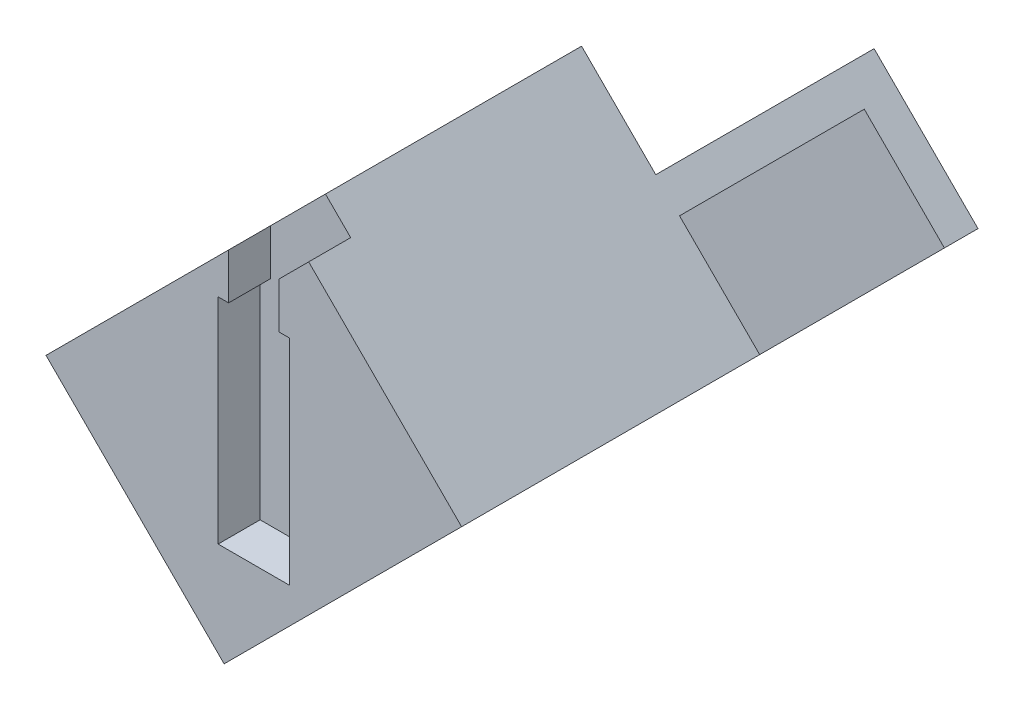
ISO-10303-21;
HEADER;
FILE_DESCRIPTION(('STEP AP214'),'2;1');
FILE_NAME('part.step','',(''),(''),'','','');
FILE_SCHEMA(('AUTOMOTIVE_DESIGN { 1 0 10303 214 1 1 1 1 }'));
ENDSEC;
DATA;
#1=APPLICATION_CONTEXT('core data for automotive mechanical design processes');
#2=APPLICATION_PROTOCOL_DEFINITION('international standard','automotive_design',2000,#1);
#3=PRODUCT_CONTEXT('',#1,'mechanical');
#4=PRODUCT('Part','Part','',(#3));
#5=PRODUCT_RELATED_PRODUCT_CATEGORY('part','',(#4));
#6=PRODUCT_DEFINITION_FORMATION('','',#4);
#7=PRODUCT_DEFINITION_CONTEXT('part definition',#1,'design');
#8=PRODUCT_DEFINITION('design','',#6,#7);
#9=PRODUCT_DEFINITION_SHAPE('','',#8);
#10=(LENGTH_UNIT() NAMED_UNIT(*) SI_UNIT(.MILLI.,.METRE.));
#11=(NAMED_UNIT(*) PLANE_ANGLE_UNIT() SI_UNIT($,.RADIAN.));
#12=(NAMED_UNIT(*) SI_UNIT($,.STERADIAN.) SOLID_ANGLE_UNIT());
#13=UNCERTAINTY_MEASURE_WITH_UNIT(LENGTH_MEASURE(1.E-05),#10,'distance_accuracy_value','');
#14=(GEOMETRIC_REPRESENTATION_CONTEXT(3) GLOBAL_UNCERTAINTY_ASSIGNED_CONTEXT((#13)) GLOBAL_UNIT_ASSIGNED_CONTEXT((#10,
#11,#12)) REPRESENTATION_CONTEXT('',''));
#15=CARTESIAN_POINT('',(0.,0.,0.));
#16=DIRECTION('',(0.,0.,1.));
#17=DIRECTION('',(1.,0.,0.));
#18=AXIS2_PLACEMENT_3D('',#15,#16,#17);
#19=CARTESIAN_POINT('',(-24.6428637527933,-43.7641840963524,-47.5));
#20=DIRECTION('',(0.707106781186542,-0.707106781186554,0.));
#21=DIRECTION('',(0.707106781186554,0.707106781186541,0.));
#22=AXIS2_PLACEMENT_3D('',#19,#20,#21);
#23=PLANE('',#22);
#24=DIRECTION('',(0.,0.,1.));
#25=VECTOR('',#24,1.);
#26=CARTESIAN_POINT('',(17.3314754519512,-1.78984489160859,-25.5));
#27=LINE('',#26,#25);
#28=CARTESIAN_POINT('',(17.3314754519512,-1.78984489160859,-47.5));
#29=VERTEX_POINT('',#28);
#30=CARTESIAN_POINT('',(17.3314754519512,-1.78984489160859,-25.5));
#31=VERTEX_POINT('',#30);
#32=EDGE_CURVE('E426',#29,#31,#27,.T.);
#33=ORIENTED_EDGE('',*,*,#32,.F.);
#34=DIRECTION('',(0.707106781186554,0.707106781186542,0.));
#35=VECTOR('',#34,1.);
#36=CARTESIAN_POINT('',(-24.6428637527933,-43.7641840963524,-47.5));
#37=LINE('',#36,#35);
#38=CARTESIAN_POINT('',(19.4527957955109,0.33147545195103,-47.5));
#39=VERTEX_POINT('',#38);
#40=EDGE_CURVE('E417',#29,#39,#37,.T.);
#41=ORIENTED_EDGE('',*,*,#40,.T.);
#42=DIRECTION('',(0.,0.,-1.));
#43=VECTOR('',#42,1.);
#44=CARTESIAN_POINT('',(19.4527957955109,0.33147545195103,-47.5));
#45=LINE('',#44,#43);
#46=CARTESIAN_POINT('',(19.4527957955109,0.331475451951037,-25.5));
#47=VERTEX_POINT('',#46);
#48=EDGE_CURVE('E61',#47,#39,#45,.T.);
#49=ORIENTED_EDGE('',*,*,#48,.F.);
#50=DIRECTION('',(0.707106781186554,0.707106781186542,0.));
#51=VECTOR('',#50,1.);
#52=CARTESIAN_POINT('',(-24.6428637527933,-43.7641840963524,-25.5));
#53=LINE('',#52,#51);
#54=EDGE_CURVE('E44',#31,#47,#53,.T.);
#55=ORIENTED_EDGE('',*,*,#54,.F.);
#56=EDGE_LOOP('',(#33,#41,#49,#55));
#57=FACE_BOUND('',#56,.T.);
#58=ADVANCED_FACE('F35',(#57),#23,.T.);
#59=CARTESIAN_POINT('',(-27.4712908775395,-40.9357569716062,-25.5));
#60=DIRECTION('',(-0.707106781186542,0.707106781186554,0.));
#61=DIRECTION('',(-0.707106781186554,-0.707106781186541,0.));
#62=AXIS2_PLACEMENT_3D('',#59,#60,#61);
#63=PLANE('',#62);
#64=DIRECTION('',(0.,0.,1.));
#65=VECTOR('',#64,1.);
#66=CARTESIAN_POINT('',(14.503048327205,1.03858223313762,-25.5));
#67=LINE('',#66,#65);
#68=CARTESIAN_POINT('',(14.503048327205,1.03858223313762,-51.5));
#69=VERTEX_POINT('',#68);
#70=CARTESIAN_POINT('',(14.503048327205,1.03858223313762,-25.5));
#71=VERTEX_POINT('',#70);
#72=EDGE_CURVE('E234',#69,#71,#67,.T.);
#73=ORIENTED_EDGE('',*,*,#72,.T.);
#74=DIRECTION('',(0.707106781186554,0.707106781186542,0.));
#75=VECTOR('',#74,1.);
#76=CARTESIAN_POINT('',(-27.4712908775395,-40.9357569716062,-25.5));
#77=LINE('',#76,#75);
#78=CARTESIAN_POINT('',(16.6243686707647,3.15990257669724,-25.5));
#79=VERTEX_POINT('',#78);
#80=EDGE_CURVE('E11',#71,#79,#77,.T.);
#81=ORIENTED_EDGE('',*,*,#80,.T.);
#82=DIRECTION('',(0.,0.,1.));
#83=VECTOR('',#82,1.);
#84=CARTESIAN_POINT('',(16.6243686707647,3.15990257669724,-25.5));
#85=LINE('',#84,#83);
#86=CARTESIAN_POINT('',(16.6243686707647,3.15990257669724,-51.5));
#87=VERTEX_POINT('',#86);
#88=EDGE_CURVE('E418',#87,#79,#85,.T.);
#89=ORIENTED_EDGE('',*,*,#88,.F.);
#90=DIRECTION('',(0.707106781186554,0.707106781186541,0.));
#91=VECTOR('',#90,1.);
#92=CARTESIAN_POINT('',(-11.6599025766975,-25.1243686707644,-51.5));
#93=LINE('',#92,#91);
#94=EDGE_CURVE('E438',#69,#87,#93,.T.);
#95=ORIENTED_EDGE('',*,*,#94,.F.);
#96=EDGE_LOOP('',(#73,#81,#89,#95));
#97=FACE_BOUND('',#96,.T.);
#98=ADVANCED_FACE('F521',(#97),#63,.T.);
#99=CARTESIAN_POINT('',(0.,0.,-25.5));
#100=DIRECTION('',(0.,0.,-1.));
#101=DIRECTION('',(-1.,0.,0.));
#102=AXIS2_PLACEMENT_3D('',#99,#100,#101);
#103=PLANE('',#102);
#104=DIRECTION('',(0.707106781186542,-0.707106781186553,0.));
#105=VECTOR('',#104,1.);
#106=CARTESIAN_POINT('',(-20.4987373415292,-16.2855339059326,-25.5));
#107=LINE('',#106,#105);
#108=CARTESIAN_POINT('',(-8.83147545195129,-27.9527957955106,-25.5));
#109=VERTEX_POINT('',#108);
#110=CARTESIAN_POINT('',(0.714466094067098,-37.4987373415292,-25.5));
#111=VERTEX_POINT('',#110);
#112=EDGE_CURVE('E291',#109,#111,#107,.T.);
#113=ORIENTED_EDGE('',*,*,#112,.F.);
#114=CARTESIAN_POINT('',(-6.71015510839162,-25.831475451951,-25.5));
#115=VERTEX_POINT('',#114);
#116=EDGE_CURVE('E243',#109,#115,#53,.T.);
#117=ORIENTED_EDGE('',*,*,#116,.T.);
#118=DIRECTION('',(-0.707106781186547,0.707106781186548,0.));
#119=VECTOR('',#118,1.);
#120=CARTESIAN_POINT('',(-16.2560966544097,-16.2855339059327,-25.5));
#121=LINE('',#120,#119);
#122=CARTESIAN_POINT('',(0.714466094067394,-33.2560966544098,-25.5));
#123=VERTEX_POINT('',#122);
#124=EDGE_CURVE('E248',#123,#115,#121,.T.);
#125=ORIENTED_EDGE('',*,*,#124,.F.);
#126=DIRECTION('',(-0.707106781186551,-0.707106781186544,0.));
#127=VECTOR('',#126,1.);
#128=CARTESIAN_POINT('',(21.2205627484771,-12.7500000000001,-25.5));
#129=LINE('',#128,#127);
#130=CARTESIAN_POINT('',(24.7560966544098,-9.21446609406741,-25.5));
#131=VERTEX_POINT('',#130);
#132=EDGE_CURVE('E311',#131,#123,#129,.T.);
#133=ORIENTED_EDGE('',*,*,#132,.F.);
#134=DIRECTION('',(0.707106781186547,-0.707106781186548,0.));
#135=VECTOR('',#134,1.);
#136=CARTESIAN_POINT('',(7.78553390593269,7.75609665440974,-25.5));
#137=LINE('',#136,#135);
#138=EDGE_CURVE('E260',#31,#131,#137,.T.);
#139=ORIENTED_EDGE('',*,*,#138,.F.);
#140=ORIENTED_EDGE('',*,*,#54,.T.);
#141=DIRECTION('',(-0.707106781186541,0.707106781186554,0.));
#142=VECTOR('',#141,1.);
#143=CARTESIAN_POINT('',(28.9987373415292,-9.21446609406744,-25.5));
#144=LINE('',#143,#142);
#145=CARTESIAN_POINT('',(28.9987373415292,-9.21446609406744,-25.5));
#146=VERTEX_POINT('',#145);
#147=EDGE_CURVE('E300',#146,#47,#144,.T.);
#148=ORIENTED_EDGE('',*,*,#147,.F.);
#149=DIRECTION('',(-0.707106781186551,-0.707106781186544,0.));
#150=VECTOR('',#149,1.);
#151=CARTESIAN_POINT('',(25.4632034355964,-12.7500000000001,-25.5));
#152=LINE('',#151,#150);
#153=EDGE_CURVE('E314',#146,#111,#152,.T.);
#154=ORIENTED_EDGE('',*,*,#153,.T.);
#155=EDGE_LOOP('',(#113,#117,#125,#133,#139,#140,#148,#154));
#156=FACE_BOUND('',#155,.T.);
#157=ADVANCED_FACE('F394',(#156),#103,.T.);
#158=CARTESIAN_POINT('',(4.25000000000015,8.46320343559646,5.));
#159=DIRECTION('',(0.707106781186544,-0.707106781186551,0.));
#160=DIRECTION('',(0.707106781186551,0.707106781186544,0.));
#161=AXIS2_PLACEMENT_3D('',#158,#159,#160);
#162=PLANE('',#161);
#163=DIRECTION('',(-0.707106781186551,-0.707106781186544,0.));
#164=VECTOR('',#163,1.);
#165=CARTESIAN_POINT('',(4.25000000000015,8.46320343559646,5.));
#166=LINE('',#165,#164);
#167=CARTESIAN_POINT('',(7.78553390593292,11.9987373415292,5.));
#168=VERTEX_POINT('',#167);
#169=CARTESIAN_POINT('',(1.24999999999985,5.4632034355962,5.));
#170=VERTEX_POINT('',#169);
#171=EDGE_CURVE('E385',#168,#170,#166,.T.);
#172=ORIENTED_EDGE('',*,*,#171,.F.);
#173=DIRECTION('',(0.,0.,1.));
#174=VECTOR('',#173,1.);
#175=CARTESIAN_POINT('',(7.78553390593292,11.9987373415292,-60.5));
#176=LINE('',#175,#174);
#177=CARTESIAN_POINT('',(7.78553390593292,11.9987373415292,-25.5));
#178=VERTEX_POINT('',#177);
#179=EDGE_CURVE('E303',#178,#168,#176,.T.);
#180=ORIENTED_EDGE('',*,*,#179,.F.);
#181=DIRECTION('',(0.707106781186551,0.707106781186544,0.));
#182=VECTOR('',#181,1.);
#183=CARTESIAN_POINT('',(-16.9632034355964,-12.7499999999998,-25.5));
#184=LINE('',#183,#182);
#185=CARTESIAN_POINT('',(-20.4987373415292,-16.2855339059326,-25.5));
#186=VERTEX_POINT('',#185);
#187=EDGE_CURVE('E319',#186,#178,#184,.T.);
#188=ORIENTED_EDGE('',*,*,#187,.F.);
#189=DIRECTION('',(0.,0.,1.));
#190=VECTOR('',#189,1.);
#191=CARTESIAN_POINT('',(-20.4987373415292,-16.2855339059326,-60.5));
#192=LINE('',#191,#190);
#193=CARTESIAN_POINT('',(-20.4987373415292,-16.2855339059326,10.));
#194=VERTEX_POINT('',#193);
#195=EDGE_CURVE('E287',#186,#194,#192,.T.);
#196=ORIENTED_EDGE('',*,*,#195,.T.);
#197=DIRECTION('',(-0.707106781186551,-0.707106781186544,0.));
#198=VECTOR('',#197,1.);
#199=CARTESIAN_POINT('',(1.24999999999985,5.4632034355962,10.));
#200=LINE('',#199,#198);
#201=CARTESIAN_POINT('',(1.24999999999985,5.4632034355962,10.));
#202=VERTEX_POINT('',#201);
#203=EDGE_CURVE('E341',#202,#194,#200,.T.);
#204=ORIENTED_EDGE('',*,*,#203,.F.);
#205=DIRECTION('',(0.,0.,-1.));
#206=VECTOR('',#205,1.);
#207=CARTESIAN_POINT('',(1.24999999999985,5.4632034355962,10.));
#208=LINE('',#207,#206);
#209=EDGE_CURVE('E369',#202,#170,#208,.T.);
#210=ORIENTED_EDGE('',*,*,#209,.T.);
#211=EDGE_LOOP('',(#172,#180,#188,#196,#204,#210));
#212=FACE_BOUND('',#211,.T.);
#213=ADVANCED_FACE('F482',(#212),#162,.F.);
#214=CARTESIAN_POINT('',(0.,0.,5.));
#215=DIRECTION('',(0.,-1.,0.));
#216=DIRECTION('',(0.,0.,-1.));
#217=AXIS2_PLACEMENT_3D('',#214,#215,#216);
#218=PLANE('',#217);
#219=DIRECTION('',(-1.,0.,0.));
#220=VECTOR('',#219,1.);
#221=CARTESIAN_POINT('',(0.,0.,5.));
#222=LINE('',#221,#220);
#223=CARTESIAN_POINT('',(8.5,0.,5.));
#224=VERTEX_POINT('',#223);
#225=CARTESIAN_POINT('',(7.24999999999992,0.,5.));
#226=VERTEX_POINT('',#225);
#227=EDGE_CURVE('E331',#224,#226,#222,.T.);
#228=ORIENTED_EDGE('',*,*,#227,.F.);
#229=DIRECTION('',(0.,0.,-1.));
#230=VECTOR('',#229,1.);
#231=CARTESIAN_POINT('',(8.5,0.,5.));
#232=LINE('',#231,#230);
#233=CARTESIAN_POINT('',(8.50000000000001,0.,10.));
#234=VERTEX_POINT('',#233);
#235=EDGE_CURVE('E377',#234,#224,#232,.T.);
#236=ORIENTED_EDGE('',*,*,#235,.F.);
#237=DIRECTION('',(1.,0.,0.));
#238=VECTOR('',#237,1.);
#239=CARTESIAN_POINT('',(7.25,0.,10.));
#240=LINE('',#239,#238);
#241=CARTESIAN_POINT('',(7.25,0.,10.));
#242=VERTEX_POINT('',#241);
#243=EDGE_CURVE('E348',#242,#234,#240,.T.);
#244=ORIENTED_EDGE('',*,*,#243,.F.);
#245=DIRECTION('',(0.,0.,-1.));
#246=VECTOR('',#245,1.);
#247=CARTESIAN_POINT('',(7.25,0.,10.));
#248=LINE('',#247,#246);
#249=EDGE_CURVE('E360',#242,#226,#248,.T.);
#250=ORIENTED_EDGE('',*,*,#249,.T.);
#251=EDGE_LOOP('',(#228,#236,#244,#250));
#252=FACE_BOUND('',#251,.T.);
#253=ADVANCED_FACE('F496',(#252),#218,.T.);
#254=CARTESIAN_POINT('',(0.,0.,5.));
#255=DIRECTION('',(0.,0.,1.));
#256=DIRECTION('',(1.,0.,0.));
#257=AXIS2_PLACEMENT_3D('',#254,#255,#256);
#258=PLANE('',#257);
#259=DIRECTION('',(0.,1.,0.));
#260=VECTOR('',#259,1.);
#261=CARTESIAN_POINT('',(1.25,0.,5.));
#262=LINE('',#261,#260);
#263=CARTESIAN_POINT('',(1.24999999999993,0.,5.));
#264=VERTEX_POINT('',#263);
#265=EDGE_CURVE('E334',#264,#170,#262,.T.);
#266=ORIENTED_EDGE('',*,*,#265,.F.);
#267=DIRECTION('',(-1.,0.,0.));
#268=VECTOR('',#267,1.);
#269=CARTESIAN_POINT('',(0.,0.,5.));
#270=LINE('',#269,#268);
#271=CARTESIAN_POINT('',(0.,0.,5.));
#272=VERTEX_POINT('',#271);
#273=EDGE_CURVE('E39',#264,#272,#270,.T.);
#274=ORIENTED_EDGE('',*,*,#273,.T.);
#275=DIRECTION('',(0.,-1.,0.));
#276=VECTOR('',#275,1.);
#277=CARTESIAN_POINT('',(0.,0.,5.));
#278=LINE('',#277,#276);
#279=CARTESIAN_POINT('',(0.,-25.5,5.));
#280=VERTEX_POINT('',#279);
#281=EDGE_CURVE('E322',#272,#280,#278,.T.);
#282=ORIENTED_EDGE('',*,*,#281,.T.);
#283=DIRECTION('',(1.,0.,0.));
#284=VECTOR('',#283,1.);
#285=CARTESIAN_POINT('',(0.,-25.5,5.));
#286=LINE('',#285,#284);
#287=CARTESIAN_POINT('',(8.50000000000001,-25.5,5.));
#288=VERTEX_POINT('',#287);
#289=EDGE_CURVE('E325',#280,#288,#286,.T.);
#290=ORIENTED_EDGE('',*,*,#289,.T.);
#291=DIRECTION('',(0.,1.,0.));
#292=VECTOR('',#291,1.);
#293=CARTESIAN_POINT('',(8.50000000000001,0.,5.));
#294=LINE('',#293,#292);
#295=EDGE_CURVE('E328',#288,#224,#294,.T.);
#296=ORIENTED_EDGE('',*,*,#295,.T.);
#297=ORIENTED_EDGE('',*,*,#227,.T.);
#298=DIRECTION('',(0.,1.,0.));
#299=VECTOR('',#298,1.);
#300=CARTESIAN_POINT('',(7.25,0.,5.));
#301=LINE('',#300,#299);
#302=CARTESIAN_POINT('',(7.25000000000013,5.46320343559643,5.));
#303=VERTEX_POINT('',#302);
#304=EDGE_CURVE('E339',#226,#303,#301,.T.);
#305=ORIENTED_EDGE('',*,*,#304,.T.);
#306=DIRECTION('',(-0.707106781186554,-0.707106781186541,0.));
#307=VECTOR('',#306,1.);
#308=CARTESIAN_POINT('',(7.25000000000013,5.46320343559643,5.));
#309=LINE('',#308,#307);
#310=CARTESIAN_POINT('',(10.7855339059329,8.99873734152913,5.));
#311=VERTEX_POINT('',#310);
#312=EDGE_CURVE('E278',#311,#303,#309,.T.);
#313=ORIENTED_EDGE('',*,*,#312,.F.);
#314=DIRECTION('',(0.707106781186541,-0.707106781186554,0.));
#315=VECTOR('',#314,1.);
#316=CARTESIAN_POINT('',(10.7855339059329,8.99873734152913,5.));
#317=LINE('',#316,#315);
#318=EDGE_CURVE('E275',#168,#311,#317,.T.);
#319=ORIENTED_EDGE('',*,*,#318,.F.);
#320=ORIENTED_EDGE('',*,*,#171,.T.);
#321=EDGE_LOOP('',(#266,#274,#282,#290,#296,#297,#305,#313,#319,#320));
#322=FACE_BOUND('',#321,.T.);
#323=ADVANCED_FACE('F484',(#322),#258,.T.);
#324=CARTESIAN_POINT('',(4.24999999999986,-33.9632034355965,5.));
#325=DIRECTION('',(-0.707106781186544,0.707106781186551,0.));
#326=DIRECTION('',(-0.707106781186551,-0.707106781186544,0.));
#327=AXIS2_PLACEMENT_3D('',#324,#325,#326);
#328=PLANE('',#327);
#329=DIRECTION('',(0.707106781186551,0.707106781186544,0.));
#330=VECTOR('',#329,1.);
#331=CARTESIAN_POINT('',(4.24999999999986,-33.9632034355965,10.));
#332=LINE('',#331,#330);
#333=CARTESIAN_POINT('',(0.714466094067095,-37.4987373415292,10.));
#334=VERTEX_POINT('',#333);
#335=CARTESIAN_POINT('',(28.9987373415292,-9.21446609406744,10.));
#336=VERTEX_POINT('',#335);
#337=EDGE_CURVE('E343',#334,#336,#332,.T.);
#338=ORIENTED_EDGE('',*,*,#337,.F.);
#339=DIRECTION('',(0.,0.,1.));
#340=VECTOR('',#339,1.);
#341=CARTESIAN_POINT('',(0.714466094067095,-37.4987373415292,-60.5));
#342=LINE('',#341,#340);
#343=EDGE_CURVE('E290',#111,#334,#342,.T.);
#344=ORIENTED_EDGE('',*,*,#343,.F.);
#345=ORIENTED_EDGE('',*,*,#153,.F.);
#346=DIRECTION('',(0.,0.,1.));
#347=VECTOR('',#346,1.);
#348=CARTESIAN_POINT('',(28.9987373415292,-9.21446609406744,-60.5));
#349=LINE('',#348,#347);
#350=EDGE_CURVE('E299',#146,#336,#349,.T.);
#351=ORIENTED_EDGE('',*,*,#350,.T.);
#352=EDGE_LOOP('',(#338,#344,#345,#351));
#353=FACE_BOUND('',#352,.T.);
#354=ADVANCED_FACE('F37',(#353),#328,.F.);
#355=CARTESIAN_POINT('',(0.,0.,5.));
#356=DIRECTION('',(1.,0.,0.));
#357=DIRECTION('',(0.,1.,0.));
#358=AXIS2_PLACEMENT_3D('',#355,#356,#357);
#359=PLANE('',#358);
#360=ORIENTED_EDGE('',*,*,#281,.F.);
#361=DIRECTION('',(0.,0.,-1.));
#362=VECTOR('',#361,1.);
#363=CARTESIAN_POINT('',(0.,0.,5.));
#364=LINE('',#363,#362);
#365=CARTESIAN_POINT('',(0.,0.,10.));
#366=VERTEX_POINT('',#365);
#367=EDGE_CURVE('E375',#366,#272,#364,.T.);
#368=ORIENTED_EDGE('',*,*,#367,.F.);
#369=DIRECTION('',(0.,-1.,0.));
#370=VECTOR('',#369,1.);
#371=CARTESIAN_POINT('',(0.,0.,10.));
#372=LINE('',#371,#370);
#373=CARTESIAN_POINT('',(0.,-25.5,10.));
#374=VERTEX_POINT('',#373);
#375=EDGE_CURVE('E357',#366,#374,#372,.T.);
#376=ORIENTED_EDGE('',*,*,#375,.T.);
#377=DIRECTION('',(0.,0.,-1.));
#378=VECTOR('',#377,1.);
#379=CARTESIAN_POINT('',(0.,-25.5,5.));
#380=LINE('',#379,#378);
#381=EDGE_CURVE('E383',#374,#280,#380,.T.);
#382=ORIENTED_EDGE('',*,*,#381,.T.);
#383=EDGE_LOOP('',(#360,#368,#376,#382));
#384=FACE_BOUND('',#383,.T.);
#385=ADVANCED_FACE('F505',(#384),#359,.T.);
#386=CARTESIAN_POINT('',(0.,-25.5,5.));
#387=DIRECTION('',(0.,1.,0.));
#388=DIRECTION('',(0.,0.,1.));
#389=AXIS2_PLACEMENT_3D('',#386,#387,#388);
#390=PLANE('',#389);
#391=ORIENTED_EDGE('',*,*,#289,.F.);
#392=ORIENTED_EDGE('',*,*,#381,.F.);
#393=DIRECTION('',(1.,0.,0.));
#394=VECTOR('',#393,1.);
#395=CARTESIAN_POINT('',(0.,-25.5,10.));
#396=LINE('',#395,#394);
#397=CARTESIAN_POINT('',(8.50000000000001,-25.5,10.));
#398=VERTEX_POINT('',#397);
#399=EDGE_CURVE('E354',#374,#398,#396,.T.);
#400=ORIENTED_EDGE('',*,*,#399,.T.);
#401=DIRECTION('',(0.,0.,-1.));
#402=VECTOR('',#401,1.);
#403=CARTESIAN_POINT('',(8.50000000000001,-25.5,5.));
#404=LINE('',#403,#402);
#405=EDGE_CURVE('E380',#398,#288,#404,.T.);
#406=ORIENTED_EDGE('',*,*,#405,.T.);
#407=EDGE_LOOP('',(#391,#392,#400,#406));
#408=FACE_BOUND('',#407,.T.);
#409=ADVANCED_FACE('F502',(#408),#390,.T.);
#410=CARTESIAN_POINT('',(8.5,0.,5.));
#411=DIRECTION('',(-1.,0.,0.));
#412=DIRECTION('',(0.,-1.,0.));
#413=AXIS2_PLACEMENT_3D('',#410,#411,#412);
#414=PLANE('',#413);
#415=ORIENTED_EDGE('',*,*,#295,.F.);
#416=ORIENTED_EDGE('',*,*,#405,.F.);
#417=DIRECTION('',(0.,-1.,0.));
#418=VECTOR('',#417,1.);
#419=CARTESIAN_POINT('',(8.50000000000001,0.,10.));
#420=LINE('',#419,#418);
#421=EDGE_CURVE('E351',#234,#398,#420,.T.);
#422=ORIENTED_EDGE('',*,*,#421,.F.);
#423=ORIENTED_EDGE('',*,*,#235,.T.);
#424=EDGE_LOOP('',(#415,#416,#422,#423));
#425=FACE_BOUND('',#424,.T.);
#426=ADVANCED_FACE('F500',(#425),#414,.T.);
#427=ORIENTED_EDGE('',*,*,#273,.F.);
#428=DIRECTION('',(0.,0.,-1.));
#429=VECTOR('',#428,1.);
#430=CARTESIAN_POINT('',(1.25,0.,10.));
#431=LINE('',#430,#429);
#432=CARTESIAN_POINT('',(1.25,0.,10.));
#433=VERTEX_POINT('',#432);
#434=EDGE_CURVE('E372',#433,#264,#431,.T.);
#435=ORIENTED_EDGE('',*,*,#434,.F.);
#436=DIRECTION('',(1.,0.,0.));
#437=VECTOR('',#436,1.);
#438=CARTESIAN_POINT('',(0.,0.,10.));
#439=LINE('',#438,#437);
#440=EDGE_CURVE('E335',#366,#433,#439,.T.);
#441=ORIENTED_EDGE('',*,*,#440,.F.);
#442=ORIENTED_EDGE('',*,*,#367,.T.);
#443=EDGE_LOOP('',(#427,#435,#441,#442));
#444=FACE_BOUND('',#443,.T.);
#445=ADVANCED_FACE('F511',(#444),#218,.T.);
#446=CARTESIAN_POINT('',(1.25,0.,10.));
#447=DIRECTION('',(-1.,0.,0.));
#448=DIRECTION('',(0.,-1.,0.));
#449=AXIS2_PLACEMENT_3D('',#446,#447,#448);
#450=PLANE('',#449);
#451=ORIENTED_EDGE('',*,*,#265,.T.);
#452=ORIENTED_EDGE('',*,*,#209,.F.);
#453=DIRECTION('',(0.,1.,0.));
#454=VECTOR('',#453,1.);
#455=CARTESIAN_POINT('',(1.25,0.,10.));
#456=LINE('',#455,#454);
#457=EDGE_CURVE('E338',#433,#202,#456,.T.);
#458=ORIENTED_EDGE('',*,*,#457,.F.);
#459=ORIENTED_EDGE('',*,*,#434,.T.);
#460=EDGE_LOOP('',(#451,#452,#458,#459));
#461=FACE_BOUND('',#460,.T.);
#462=ADVANCED_FACE('F513',(#461),#450,.F.);
#463=CARTESIAN_POINT('',(7.25,0.,10.));
#464=DIRECTION('',(-1.,0.,0.));
#465=DIRECTION('',(0.,-1.,0.));
#466=AXIS2_PLACEMENT_3D('',#463,#464,#465);
#467=PLANE('',#466);
#468=ORIENTED_EDGE('',*,*,#304,.F.);
#469=ORIENTED_EDGE('',*,*,#249,.F.);
#470=DIRECTION('',(0.,1.,0.));
#471=VECTOR('',#470,1.);
#472=CARTESIAN_POINT('',(7.25,0.,10.));
#473=LINE('',#472,#471);
#474=CARTESIAN_POINT('',(7.25000000000013,5.46320343559643,10.));
#475=VERTEX_POINT('',#474);
#476=EDGE_CURVE('E345',#242,#475,#473,.T.);
#477=ORIENTED_EDGE('',*,*,#476,.T.);
#478=DIRECTION('',(0.,0.,-1.));
#479=VECTOR('',#478,1.);
#480=CARTESIAN_POINT('',(7.24999999999983,5.46320343559643,10.));
#481=LINE('',#480,#479);
#482=EDGE_CURVE('E366',#475,#303,#481,.T.);
#483=ORIENTED_EDGE('',*,*,#482,.T.);
#484=EDGE_LOOP('',(#468,#469,#477,#483));
#485=FACE_BOUND('',#484,.T.);
#486=ADVANCED_FACE('F493',(#485),#467,.T.);
#487=CARTESIAN_POINT('',(0.,0.,10.));
#488=DIRECTION('',(0.,0.,1.));
#489=DIRECTION('',(1.,0.,0.));
#490=AXIS2_PLACEMENT_3D('',#487,#488,#489);
#491=PLANE('',#490);
#492=DIRECTION('',(0.707106781186554,0.707106781186541,0.));
#493=VECTOR('',#492,1.);
#494=CARTESIAN_POINT('',(7.25000000000013,5.46320343559643,10.));
#495=LINE('',#494,#493);
#496=CARTESIAN_POINT('',(10.7855339059329,8.99873734152913,10.));
#497=VERTEX_POINT('',#496);
#498=EDGE_CURVE('E272',#475,#497,#495,.T.);
#499=ORIENTED_EDGE('',*,*,#498,.F.);
#500=ORIENTED_EDGE('',*,*,#476,.F.);
#501=ORIENTED_EDGE('',*,*,#243,.T.);
#502=ORIENTED_EDGE('',*,*,#421,.T.);
#503=ORIENTED_EDGE('',*,*,#399,.F.);
#504=ORIENTED_EDGE('',*,*,#375,.F.);
#505=ORIENTED_EDGE('',*,*,#440,.T.);
#506=ORIENTED_EDGE('',*,*,#457,.T.);
#507=ORIENTED_EDGE('',*,*,#203,.T.);
#508=DIRECTION('',(0.707106781186541,-0.707106781186553,0.));
#509=VECTOR('',#508,1.);
#510=CARTESIAN_POINT('',(-20.4987373415292,-16.2855339059326,10.));
#511=LINE('',#510,#509);
#512=EDGE_CURVE('E284',#194,#334,#511,.T.);
#513=ORIENTED_EDGE('',*,*,#512,.T.);
#514=ORIENTED_EDGE('',*,*,#337,.T.);
#515=DIRECTION('',(-0.707106781186541,0.707106781186554,0.));
#516=VECTOR('',#515,1.);
#517=CARTESIAN_POINT('',(28.9987373415292,-9.21446609406744,10.));
#518=LINE('',#517,#516);
#519=EDGE_CURVE('E294',#336,#497,#518,.T.);
#520=ORIENTED_EDGE('',*,*,#519,.T.);
#521=EDGE_LOOP('',(#499,#500,#501,#502,#503,#504,#505,#506,#507,#513,#514,#520));
#522=FACE_BOUND('',#521,.T.);
#523=ADVANCED_FACE('F491',(#522),#491,.T.);
#524=CARTESIAN_POINT('',(-11.6599025766975,-25.1243686707644,-25.5));
#525=VERTEX_POINT('',#524);
#526=CARTESIAN_POINT('',(-9.53858223313778,-23.0030483272048,-25.5));
#527=VERTEX_POINT('',#526);
#528=EDGE_CURVE('E46',#525,#527,#77,.T.);
#529=ORIENTED_EDGE('',*,*,#528,.F.);
#530=EDGE_CURVE('E288',#186,#525,#107,.T.);
#531=ORIENTED_EDGE('',*,*,#530,.F.);
#532=ORIENTED_EDGE('',*,*,#187,.T.);
#533=EDGE_CURVE('E304',#79,#178,#144,.T.);
#534=ORIENTED_EDGE('',*,*,#533,.F.);
#535=ORIENTED_EDGE('',*,*,#80,.F.);
#536=CARTESIAN_POINT('',(7.78553390593269,7.75609665440974,-25.5));
#537=VERTEX_POINT('',#536);
#538=EDGE_CURVE('E262',#537,#71,#137,.T.);
#539=ORIENTED_EDGE('',*,*,#538,.F.);
#540=DIRECTION('',(0.707106781186551,0.707106781186544,0.));
#541=VECTOR('',#540,1.);
#542=CARTESIAN_POINT('',(-12.7205627484771,-12.7499999999999,-25.5));
#543=LINE('',#542,#541);
#544=CARTESIAN_POINT('',(-16.2560966544097,-16.2855339059327,-25.5));
#545=VERTEX_POINT('',#544);
#546=EDGE_CURVE('E246',#545,#537,#543,.T.);
#547=ORIENTED_EDGE('',*,*,#546,.F.);
#548=EDGE_CURVE('E227',#527,#545,#121,.T.);
#549=ORIENTED_EDGE('',*,*,#548,.F.);
#550=EDGE_LOOP('',(#529,#531,#532,#534,#535,#539,#547,#549));
#551=FACE_BOUND('',#550,.T.);
#552=ADVANCED_FACE('F244',(#551),#103,.T.);
#553=CARTESIAN_POINT('',(-12.7205627484771,-12.7499999999999,-25.5));
#554=DIRECTION('',(0.707106781186544,-0.707106781186551,0.));
#555=DIRECTION('',(0.707106781186551,0.707106781186544,0.));
#556=AXIS2_PLACEMENT_3D('',#553,#554,#555);
#557=PLANE('',#556);
#558=DIRECTION('',(0.707106781186551,0.707106781186544,0.));
#559=VECTOR('',#558,1.);
#560=CARTESIAN_POINT('',(-12.7205627484771,-12.7499999999999,0.));
#561=LINE('',#560,#559);
#562=CARTESIAN_POINT('',(-16.2560966544097,-16.2855339059327,0.));
#563=VERTEX_POINT('',#562);
#564=CARTESIAN_POINT('',(7.78553390593269,7.75609665440974,0.));
#565=VERTEX_POINT('',#564);
#566=EDGE_CURVE('E307',#563,#565,#561,.T.);
#567=ORIENTED_EDGE('',*,*,#566,.F.);
#568=DIRECTION('',(0.,0.,-1.));
#569=VECTOR('',#568,1.);
#570=CARTESIAN_POINT('',(-16.2560966544097,-16.2855339059327,28.9999999999999));
#571=LINE('',#570,#569);
#572=EDGE_CURVE('E258',#563,#545,#571,.T.);
#573=ORIENTED_EDGE('',*,*,#572,.T.);
#574=ORIENTED_EDGE('',*,*,#546,.T.);
#575=DIRECTION('',(0.,0.,-1.));
#576=VECTOR('',#575,1.);
#577=CARTESIAN_POINT('',(7.78553390593269,7.75609665440974,28.9999999999999));
#578=LINE('',#577,#576);
#579=EDGE_CURVE('E265',#565,#537,#578,.T.);
#580=ORIENTED_EDGE('',*,*,#579,.F.);
#581=EDGE_LOOP('',(#567,#573,#574,#580));
#582=FACE_BOUND('',#581,.T.);
#583=ADVANCED_FACE('F553',(#582),#557,.T.);
#584=CARTESIAN_POINT('',(21.2205627484771,-12.7500000000001,-25.5));
#585=DIRECTION('',(-0.707106781186544,0.707106781186551,0.));
#586=DIRECTION('',(-0.707106781186551,-0.707106781186544,0.));
#587=AXIS2_PLACEMENT_3D('',#584,#585,#586);
#588=PLANE('',#587);
#589=DIRECTION('',(-0.707106781186551,-0.707106781186544,0.));
#590=VECTOR('',#589,1.);
#591=CARTESIAN_POINT('',(21.2205627484771,-12.7500000000001,0.));
#592=LINE('',#591,#590);
#593=CARTESIAN_POINT('',(24.7560966544098,-9.21446609406742,0.));
#594=VERTEX_POINT('',#593);
#595=CARTESIAN_POINT('',(0.714466094067394,-33.2560966544098,0.));
#596=VERTEX_POINT('',#595);
#597=EDGE_CURVE('E312',#594,#596,#592,.T.);
#598=ORIENTED_EDGE('',*,*,#597,.F.);
#599=DIRECTION('',(0.,0.,-1.));
#600=VECTOR('',#599,1.);
#601=CARTESIAN_POINT('',(24.7560966544098,-9.21446609406741,28.9999999999999));
#602=LINE('',#601,#600);
#603=EDGE_CURVE('E269',#594,#131,#602,.T.);
#604=ORIENTED_EDGE('',*,*,#603,.T.);
#605=ORIENTED_EDGE('',*,*,#132,.T.);
#606=DIRECTION('',(0.,0.,-1.));
#607=VECTOR('',#606,1.);
#608=CARTESIAN_POINT('',(0.714466094067394,-33.2560966544098,28.9999999999999));
#609=LINE('',#608,#607);
#610=EDGE_CURVE('E250',#596,#123,#609,.T.);
#611=ORIENTED_EDGE('',*,*,#610,.F.);
#612=EDGE_LOOP('',(#598,#604,#605,#611));
#613=FACE_BOUND('',#612,.T.);
#614=ADVANCED_FACE('F550',(#613),#588,.T.);
#615=CARTESIAN_POINT('',(0.,0.,0.));
#616=DIRECTION('',(0.,0.,1.));
#617=DIRECTION('',(1.,0.,0.));
#618=AXIS2_PLACEMENT_3D('',#615,#616,#617);
#619=PLANE('',#618);
#620=ORIENTED_EDGE('',*,*,#597,.T.);
#621=DIRECTION('',(-0.707106781186547,0.707106781186548,0.));
#622=VECTOR('',#621,1.);
#623=CARTESIAN_POINT('',(-16.2560966544097,-16.2855339059327,0.));
#624=LINE('',#623,#622);
#625=EDGE_CURVE('E255',#596,#563,#624,.T.);
#626=ORIENTED_EDGE('',*,*,#625,.T.);
#627=ORIENTED_EDGE('',*,*,#566,.T.);
#628=DIRECTION('',(0.707106781186547,-0.707106781186548,0.));
#629=VECTOR('',#628,1.);
#630=CARTESIAN_POINT('',(7.78553390593269,7.75609665440974,0.));
#631=LINE('',#630,#629);
#632=EDGE_CURVE('E266',#565,#594,#631,.T.);
#633=ORIENTED_EDGE('',*,*,#632,.T.);
#634=EDGE_LOOP('',(#620,#626,#627,#633));
#635=FACE_BOUND('',#634,.T.);
#636=ADVANCED_FACE('F549',(#635),#619,.F.);
#637=CARTESIAN_POINT('',(28.9987373415292,-9.21446609406744,-60.5));
#638=DIRECTION('',(0.707106781186554,0.707106781186541,0.));
#639=DIRECTION('',(-0.707106781186541,0.707106781186554,0.));
#640=AXIS2_PLACEMENT_3D('',#637,#638,#639);
#641=PLANE('',#640);
#642=DIRECTION('',(0.,0.,1.));
#643=VECTOR('',#642,1.);
#644=CARTESIAN_POINT('',(10.7855339059329,8.99873734152913,-4.24264068711929));
#645=LINE('',#644,#643);
#646=EDGE_CURVE('E279',#311,#497,#645,.T.);
#647=ORIENTED_EDGE('',*,*,#646,.T.);
#648=ORIENTED_EDGE('',*,*,#519,.F.);
#649=ORIENTED_EDGE('',*,*,#350,.F.);
#650=ORIENTED_EDGE('',*,*,#147,.T.);
#651=ORIENTED_EDGE('',*,*,#48,.T.);
#652=DIRECTION('',(0.707106781186541,-0.707106781186554,0.));
#653=VECTOR('',#652,1.);
#654=CARTESIAN_POINT('',(16.6243686707647,3.15990257669724,-47.5));
#655=LINE('',#654,#653);
#656=CARTESIAN_POINT('',(28.9987373415292,-9.21446609406744,-47.5));
#657=VERTEX_POINT('',#656);
#658=EDGE_CURVE('E448',#39,#657,#655,.T.);
#659=ORIENTED_EDGE('',*,*,#658,.T.);
#660=DIRECTION('',(0.,0.,1.));
#661=VECTOR('',#660,1.);
#662=CARTESIAN_POINT('',(28.9987373415292,-9.21446609406744,-51.5));
#663=LINE('',#662,#661);
#664=CARTESIAN_POINT('',(28.9987373415292,-9.21446609406744,-51.5));
#665=VERTEX_POINT('',#664);
#666=EDGE_CURVE('E452',#665,#657,#663,.T.);
#667=ORIENTED_EDGE('',*,*,#666,.F.);
#668=DIRECTION('',(0.707106781186541,-0.707106781186554,0.));
#669=VECTOR('',#668,1.);
#670=CARTESIAN_POINT('',(16.6243686707647,3.15990257669724,-51.5));
#671=LINE('',#670,#669);
#672=EDGE_CURVE('E442',#87,#665,#671,.T.);
#673=ORIENTED_EDGE('',*,*,#672,.F.);
#674=ORIENTED_EDGE('',*,*,#88,.T.);
#675=ORIENTED_EDGE('',*,*,#533,.T.);
#676=ORIENTED_EDGE('',*,*,#179,.T.);
#677=ORIENTED_EDGE('',*,*,#318,.T.);
#678=EDGE_LOOP('',(#647,#648,#649,#650,#651,#659,#667,#673,#674,#675,#676,#677));
#679=FACE_BOUND('',#678,.T.);
#680=ADVANCED_FACE('F399',(#679),#641,.T.);
#681=CARTESIAN_POINT('',(-20.4987373415292,-16.2855339059326,-60.5));
#682=DIRECTION('',(-0.707106781186553,-0.707106781186542,0.));
#683=DIRECTION('',(0.707106781186542,-0.707106781186553,0.));
#684=AXIS2_PLACEMENT_3D('',#681,#682,#683);
#685=PLANE('',#684);
#686=ORIENTED_EDGE('',*,*,#195,.F.);
#687=ORIENTED_EDGE('',*,*,#530,.T.);
#688=DIRECTION('',(0.,0.,1.));
#689=VECTOR('',#688,1.);
#690=CARTESIAN_POINT('',(-11.6599025766975,-25.1243686707644,-25.5));
#691=LINE('',#690,#689);
#692=CARTESIAN_POINT('',(-11.6599025766975,-25.1243686707644,-51.5));
#693=VERTEX_POINT('',#692);
#694=EDGE_CURVE('E239',#693,#525,#691,.T.);
#695=ORIENTED_EDGE('',*,*,#694,.F.);
#696=DIRECTION('',(-0.707106781186541,0.707106781186553,0.));
#697=VECTOR('',#696,1.);
#698=CARTESIAN_POINT('',(0.714466094067098,-37.4987373415292,-51.5));
#699=LINE('',#698,#697);
#700=CARTESIAN_POINT('',(0.714466094067098,-37.4987373415292,-51.5));
#701=VERTEX_POINT('',#700);
#702=EDGE_CURVE('E435',#701,#693,#699,.T.);
#703=ORIENTED_EDGE('',*,*,#702,.F.);
#704=DIRECTION('',(0.,0.,1.));
#705=VECTOR('',#704,1.);
#706=CARTESIAN_POINT('',(0.714466094067098,-37.4987373415292,-51.5));
#707=LINE('',#706,#705);
#708=CARTESIAN_POINT('',(0.714466094067098,-37.4987373415292,-47.5));
#709=VERTEX_POINT('',#708);
#710=EDGE_CURVE('E446',#701,#709,#707,.T.);
#711=ORIENTED_EDGE('',*,*,#710,.T.);
#712=DIRECTION('',(-0.707106781186541,0.707106781186553,0.));
#713=VECTOR('',#712,1.);
#714=CARTESIAN_POINT('',(0.714466094067098,-37.4987373415292,-47.5));
#715=LINE('',#714,#713);
#716=CARTESIAN_POINT('',(-8.83147545195128,-27.9527957955106,-47.5));
#717=VERTEX_POINT('',#716);
#718=EDGE_CURVE('E414',#709,#717,#715,.T.);
#719=ORIENTED_EDGE('',*,*,#718,.T.);
#720=DIRECTION('',(0.,0.,-1.));
#721=VECTOR('',#720,1.);
#722=CARTESIAN_POINT('',(-8.83147545195129,-27.9527957955106,-47.5));
#723=LINE('',#722,#721);
#724=EDGE_CURVE('E411',#109,#717,#723,.T.);
#725=ORIENTED_EDGE('',*,*,#724,.F.);
#726=ORIENTED_EDGE('',*,*,#112,.T.);
#727=ORIENTED_EDGE('',*,*,#343,.T.);
#728=ORIENTED_EDGE('',*,*,#512,.F.);
#729=EDGE_LOOP('',(#686,#687,#695,#703,#711,#719,#725,#726,#727,#728));
#730=FACE_BOUND('',#729,.T.);
#731=ADVANCED_FACE('F407',(#730),#685,.T.);
#732=CARTESIAN_POINT('',(7.25000000000013,5.46320343559643,-4.24264068711929));
#733=DIRECTION('',(0.707106781186541,-0.707106781186554,0.));
#734=DIRECTION('',(0.707106781186554,0.707106781186541,0.));
#735=AXIS2_PLACEMENT_3D('',#732,#733,#734);
#736=PLANE('',#735);
#737=ORIENTED_EDGE('',*,*,#312,.T.);
#738=ORIENTED_EDGE('',*,*,#482,.F.);
#739=ORIENTED_EDGE('',*,*,#498,.T.);
#740=ORIENTED_EDGE('',*,*,#646,.F.);
#741=EDGE_LOOP('',(#737,#738,#739,#740));
#742=FACE_BOUND('',#741,.T.);
#743=ADVANCED_FACE('F487',(#742),#736,.F.);
#744=CARTESIAN_POINT('',(7.78553390593269,7.75609665440974,28.9999999999999));
#745=DIRECTION('',(0.707106781186548,0.707106781186547,0.));
#746=DIRECTION('',(-0.707106781186547,0.707106781186548,0.));
#747=AXIS2_PLACEMENT_3D('',#744,#745,#746);
#748=PLANE('',#747);
#749=ORIENTED_EDGE('',*,*,#579,.T.);
#750=ORIENTED_EDGE('',*,*,#538,.T.);
#751=ORIENTED_EDGE('',*,*,#72,.F.);
#752=DIRECTION('',(0.707106781186542,-0.707106781186554,0.));
#753=VECTOR('',#752,1.);
#754=CARTESIAN_POINT('',(14.503048327205,1.03858223313762,-51.5));
#755=LINE('',#754,#753);
#756=CARTESIAN_POINT('',(17.3314754519512,-1.78984489160859,-51.5));
#757=VERTEX_POINT('',#756);
#758=EDGE_CURVE('E432',#69,#757,#755,.T.);
#759=ORIENTED_EDGE('',*,*,#758,.T.);
#760=EDGE_CURVE('E235',#757,#29,#27,.T.);
#761=ORIENTED_EDGE('',*,*,#760,.T.);
#762=ORIENTED_EDGE('',*,*,#32,.T.);
#763=ORIENTED_EDGE('',*,*,#138,.T.);
#764=ORIENTED_EDGE('',*,*,#603,.F.);
#765=ORIENTED_EDGE('',*,*,#632,.F.);
#766=EDGE_LOOP('',(#749,#750,#751,#759,#761,#762,#763,#764,#765));
#767=FACE_BOUND('',#766,.T.);
#768=ADVANCED_FACE('F520',(#767),#748,.F.);
#769=CARTESIAN_POINT('',(-16.2560966544097,-16.2855339059327,28.9999999999999));
#770=DIRECTION('',(-0.707106781186548,-0.707106781186547,0.));
#771=DIRECTION('',(0.707106781186547,-0.707106781186548,0.));
#772=AXIS2_PLACEMENT_3D('',#769,#770,#771);
#773=PLANE('',#772);
#774=ORIENTED_EDGE('',*,*,#610,.T.);
#775=ORIENTED_EDGE('',*,*,#124,.T.);
#776=DIRECTION('',(0.,0.,-1.));
#777=VECTOR('',#776,1.);
#778=CARTESIAN_POINT('',(-6.71015510839162,-25.831475451951,-25.5));
#779=LINE('',#778,#777);
#780=CARTESIAN_POINT('',(-6.71015510839162,-25.831475451951,-47.5));
#781=VERTEX_POINT('',#780);
#782=EDGE_CURVE('E53',#115,#781,#779,.T.);
#783=ORIENTED_EDGE('',*,*,#782,.T.);
#784=CARTESIAN_POINT('',(-6.71015510839161,-25.831475451951,-51.5));
#785=VERTEX_POINT('',#784);
#786=EDGE_CURVE('E423',#781,#785,#779,.T.);
#787=ORIENTED_EDGE('',*,*,#786,.T.);
#788=DIRECTION('',(0.707106781186542,-0.707106781186554,0.));
#789=VECTOR('',#788,1.);
#790=CARTESIAN_POINT('',(-9.53858223313778,-23.0030483272048,-51.5));
#791=LINE('',#790,#789);
#792=CARTESIAN_POINT('',(-9.53858223313778,-23.0030483272048,-51.5));
#793=VERTEX_POINT('',#792);
#794=EDGE_CURVE('E230',#793,#785,#791,.T.);
#795=ORIENTED_EDGE('',*,*,#794,.F.);
#796=DIRECTION('',(0.,0.,-1.));
#797=VECTOR('',#796,1.);
#798=CARTESIAN_POINT('',(-9.53858223313778,-23.0030483272048,-25.5));
#799=LINE('',#798,#797);
#800=EDGE_CURVE('E221',#527,#793,#799,.T.);
#801=ORIENTED_EDGE('',*,*,#800,.F.);
#802=ORIENTED_EDGE('',*,*,#548,.T.);
#803=ORIENTED_EDGE('',*,*,#572,.F.);
#804=ORIENTED_EDGE('',*,*,#625,.F.);
#805=EDGE_LOOP('',(#774,#775,#783,#787,#795,#801,#802,#803,#804));
#806=FACE_BOUND('',#805,.T.);
#807=ADVANCED_FACE('F224',(#806),#773,.F.);
#808=ORIENTED_EDGE('',*,*,#782,.F.);
#809=ORIENTED_EDGE('',*,*,#116,.F.);
#810=ORIENTED_EDGE('',*,*,#724,.T.);
#811=EDGE_CURVE('E421',#717,#781,#37,.T.);
#812=ORIENTED_EDGE('',*,*,#811,.T.);
#813=EDGE_LOOP('',(#808,#809,#810,#812));
#814=FACE_BOUND('',#813,.T.);
#815=ADVANCED_FACE('F420',(#814),#23,.T.);
#816=ORIENTED_EDGE('',*,*,#800,.T.);
#817=EDGE_CURVE('E440',#693,#793,#93,.T.);
#818=ORIENTED_EDGE('',*,*,#817,.F.);
#819=ORIENTED_EDGE('',*,*,#694,.T.);
#820=ORIENTED_EDGE('',*,*,#528,.T.);
#821=EDGE_LOOP('',(#816,#818,#819,#820));
#822=FACE_BOUND('',#821,.T.);
#823=ADVANCED_FACE('F238',(#822),#63,.T.);
#824=CARTESIAN_POINT('',(28.9987373415292,-9.21446609406744,-51.5));
#825=DIRECTION('',(-0.707106781186543,0.707106781186552,0.));
#826=DIRECTION('',(-0.707106781186552,-0.707106781186543,0.));
#827=AXIS2_PLACEMENT_3D('',#824,#825,#826);
#828=PLANE('',#827);
#829=DIRECTION('',(-0.707106781186552,-0.707106781186543,0.));
#830=VECTOR('',#829,1.);
#831=CARTESIAN_POINT('',(28.9987373415292,-9.21446609406744,-47.5));
#832=LINE('',#831,#830);
#833=EDGE_CURVE('E439',#657,#709,#832,.T.);
#834=ORIENTED_EDGE('',*,*,#833,.T.);
#835=ORIENTED_EDGE('',*,*,#710,.F.);
#836=DIRECTION('',(-0.707106781186552,-0.707106781186543,0.));
#837=VECTOR('',#836,1.);
#838=CARTESIAN_POINT('',(28.9987373415292,-9.21446609406744,-51.5));
#839=LINE('',#838,#837);
#840=EDGE_CURVE('E444',#665,#701,#839,.T.);
#841=ORIENTED_EDGE('',*,*,#840,.F.);
#842=ORIENTED_EDGE('',*,*,#666,.T.);
#843=EDGE_LOOP('',(#834,#835,#841,#842));
#844=FACE_BOUND('',#843,.T.);
#845=ADVANCED_FACE('F469',(#844),#828,.F.);
#846=CARTESIAN_POINT('',(0.,0.,-51.5));
#847=DIRECTION('',(0.,0.,-1.));
#848=DIRECTION('',(-1.,0.,0.));
#849=AXIS2_PLACEMENT_3D('',#846,#847,#848);
#850=PLANE('',#849);
#851=ORIENTED_EDGE('',*,*,#758,.F.);
#852=ORIENTED_EDGE('',*,*,#94,.T.);
#853=ORIENTED_EDGE('',*,*,#672,.T.);
#854=ORIENTED_EDGE('',*,*,#840,.T.);
#855=ORIENTED_EDGE('',*,*,#702,.T.);
#856=ORIENTED_EDGE('',*,*,#817,.T.);
#857=ORIENTED_EDGE('',*,*,#794,.T.);
#858=DIRECTION('',(0.707106781186553,0.707106781186542,0.));
#859=VECTOR('',#858,1.);
#860=CARTESIAN_POINT('',(17.3314754519512,-1.78984489160859,-51.5));
#861=LINE('',#860,#859);
#862=EDGE_CURVE('E422',#785,#757,#861,.T.);
#863=ORIENTED_EDGE('',*,*,#862,.T.);
#864=EDGE_LOOP('',(#851,#852,#853,#854,#855,#856,#857,#863));
#865=FACE_BOUND('',#864,.T.);
#866=ADVANCED_FACE('F474',(#865),#850,.T.);
#867=CARTESIAN_POINT('',(0.,0.,-47.5));
#868=DIRECTION('',(0.,0.,-1.));
#869=DIRECTION('',(-1.,0.,0.));
#870=AXIS2_PLACEMENT_3D('',#867,#868,#869);
#871=PLANE('',#870);
#872=ORIENTED_EDGE('',*,*,#811,.F.);
#873=ORIENTED_EDGE('',*,*,#718,.F.);
#874=ORIENTED_EDGE('',*,*,#833,.F.);
#875=ORIENTED_EDGE('',*,*,#658,.F.);
#876=ORIENTED_EDGE('',*,*,#40,.F.);
#877=EDGE_CURVE('E458',#781,#29,#37,.T.);
#878=ORIENTED_EDGE('',*,*,#877,.F.);
#879=EDGE_LOOP('',(#872,#873,#874,#875,#876,#878));
#880=FACE_BOUND('',#879,.T.);
#881=ADVANCED_FACE('F464',(#880),#871,.F.);
#882=CARTESIAN_POINT('',(9.56066017177975,-9.56066017177991,0.));
#883=DIRECTION('',(0.707106781186542,-0.707106781186554,0.));
#884=DIRECTION('',(0.707106781186554,0.707106781186542,0.));
#885=AXIS2_PLACEMENT_3D('',#882,#883,#884);
#886=PLANE('',#885);
#887=ORIENTED_EDGE('',*,*,#760,.F.);
#888=ORIENTED_EDGE('',*,*,#862,.F.);
#889=ORIENTED_EDGE('',*,*,#786,.F.);
#890=ORIENTED_EDGE('',*,*,#877,.T.);
#891=EDGE_LOOP('',(#887,#888,#889,#890));
#892=FACE_BOUND('',#891,.T.);
#893=ADVANCED_FACE('F518',(#892),#886,.F.);
#894=CLOSED_SHELL('',(#58,#98,#157,#213,#253,#323,#354,#385,#409,#426,#445,#462,#486,#523,#552,
#583,#614,#636,#680,#731,#743,#768,#807,#815,#823,#845,#866,#881,#893));
#895=MANIFOLD_SOLID_BREP('B2',#894);
#896=ADVANCED_BREP_SHAPE_REPRESENTATION('',(#18,#895),#14);
#897=SHAPE_DEFINITION_REPRESENTATION(#9,#896);
ENDSEC;
END-ISO-10303-21;
